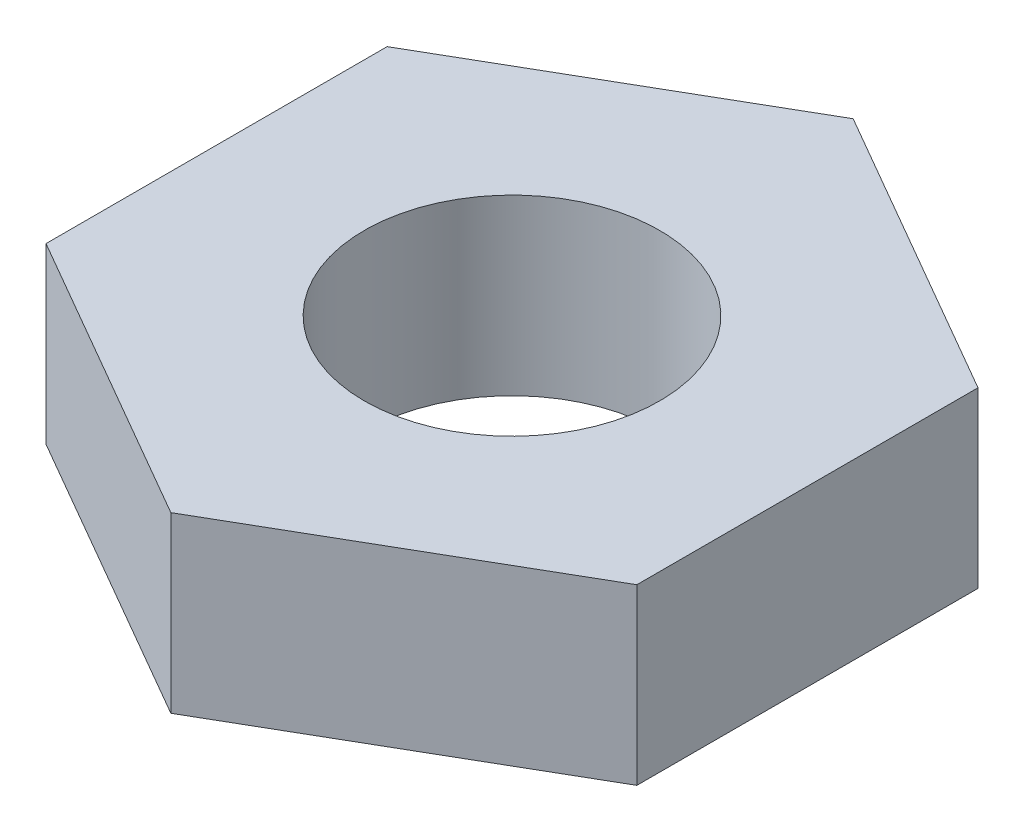
ISO-10303-21;
HEADER;
FILE_DESCRIPTION(('STEP AP214'),'2;1');
FILE_NAME('part.step','',(''),(''),'','','');
FILE_SCHEMA(('AUTOMOTIVE_DESIGN { 1 0 10303 214 1 1 1 1 }'));
ENDSEC;
DATA;
#1=APPLICATION_CONTEXT('core data for automotive mechanical design processes');
#2=APPLICATION_PROTOCOL_DEFINITION('international standard','automotive_design',2000,#1);
#3=PRODUCT_CONTEXT('',#1,'mechanical');
#4=PRODUCT('Part','Part','',(#3));
#5=PRODUCT_RELATED_PRODUCT_CATEGORY('part','',(#4));
#6=PRODUCT_DEFINITION_FORMATION('','',#4);
#7=PRODUCT_DEFINITION_CONTEXT('part definition',#1,'design');
#8=PRODUCT_DEFINITION('design','',#6,#7);
#9=PRODUCT_DEFINITION_SHAPE('','',#8);
#10=(LENGTH_UNIT() NAMED_UNIT(*) SI_UNIT(.MILLI.,.METRE.));
#11=(NAMED_UNIT(*) PLANE_ANGLE_UNIT() SI_UNIT($,.RADIAN.));
#12=(NAMED_UNIT(*) SI_UNIT($,.STERADIAN.) SOLID_ANGLE_UNIT());
#13=UNCERTAINTY_MEASURE_WITH_UNIT(LENGTH_MEASURE(1.E-05),#10,'distance_accuracy_value','');
#14=(GEOMETRIC_REPRESENTATION_CONTEXT(3) GLOBAL_UNCERTAINTY_ASSIGNED_CONTEXT((#13)) GLOBAL_UNIT_ASSIGNED_CONTEXT((#10,
#11,#12)) REPRESENTATION_CONTEXT('',''));
#15=CARTESIAN_POINT('',(0.,0.,0.));
#16=DIRECTION('',(0.,0.,1.));
#17=DIRECTION('',(1.,0.,0.));
#18=AXIS2_PLACEMENT_3D('',#15,#16,#17);
#19=CARTESIAN_POINT('',(8.5,5.,-14.7224318643354));
#20=DIRECTION('',(0.,1.,0.));
#21=DIRECTION('',(0.,0.,1.));
#22=AXIS2_PLACEMENT_3D('',#19,#20,#21);
#23=PLANE('',#22);
#24=DIRECTION('',(-0.86602540378444,0.,0.499999999999998));
#25=VECTOR('',#24,1.);
#26=CARTESIAN_POINT('',(-8.5,5.,-4.90747728811181));
#27=LINE('',#26,#25);
#28=CARTESIAN_POINT('',(0.,5.,-9.8149545762236));
#29=VERTEX_POINT('',#28);
#30=CARTESIAN_POINT('',(-8.5,5.,-4.90747728811181));
#31=VERTEX_POINT('',#30);
#32=EDGE_CURVE('E132',#29,#31,#27,.T.);
#33=ORIENTED_EDGE('',*,*,#32,.T.);
#34=DIRECTION('',(0.,0.,1.));
#35=VECTOR('',#34,1.);
#36=CARTESIAN_POINT('',(-8.5,5.,4.90747728811181));
#37=LINE('',#36,#35);
#38=CARTESIAN_POINT('',(-8.5,5.,4.90747728811181));
#39=VERTEX_POINT('',#38);
#40=EDGE_CURVE('E90',#31,#39,#37,.T.);
#41=ORIENTED_EDGE('',*,*,#40,.T.);
#42=DIRECTION('',(0.86602540378444,0.,0.499999999999998));
#43=VECTOR('',#42,1.);
#44=CARTESIAN_POINT('',(-8.5,5.,4.90747728811181));
#45=LINE('',#44,#43);
#46=CARTESIAN_POINT('',(0.,5.,9.8149545762236));
#47=VERTEX_POINT('',#46);
#48=EDGE_CURVE('E103',#39,#47,#45,.T.);
#49=ORIENTED_EDGE('',*,*,#48,.T.);
#50=DIRECTION('',(0.86602540378444,0.,-0.499999999999998));
#51=VECTOR('',#50,1.);
#52=CARTESIAN_POINT('',(8.5,5.,4.90747728811181));
#53=LINE('',#52,#51);
#54=CARTESIAN_POINT('',(8.5,5.,4.90747728811181));
#55=VERTEX_POINT('',#54);
#56=EDGE_CURVE('E97',#47,#55,#53,.T.);
#57=ORIENTED_EDGE('',*,*,#56,.T.);
#58=DIRECTION('',(0.,0.,-1.));
#59=VECTOR('',#58,1.);
#60=CARTESIAN_POINT('',(8.5,5.,4.90747728811181));
#61=LINE('',#60,#59);
#62=CARTESIAN_POINT('',(8.5,5.,-4.90747728811181));
#63=VERTEX_POINT('',#62);
#64=EDGE_CURVE('E101',#55,#63,#61,.T.);
#65=ORIENTED_EDGE('',*,*,#64,.T.);
#66=DIRECTION('',(-0.86602540378444,0.,-0.499999999999998));
#67=VECTOR('',#66,1.);
#68=CARTESIAN_POINT('',(8.5,5.,-4.90747728811181));
#69=LINE('',#68,#67);
#70=EDGE_CURVE('E53',#63,#29,#69,.T.);
#71=ORIENTED_EDGE('',*,*,#70,.T.);
#72=EDGE_LOOP('',(#33,#41,#49,#57,#65,#71));
#73=FACE_BOUND('',#72,.T.);
#74=CARTESIAN_POINT('',(0.,5.,0.));
#75=DIRECTION('',(0.,1.,0.));
#76=DIRECTION('',(0.,0.,1.));
#77=AXIS2_PLACEMENT_3D('',#74,#75,#76);
#78=CIRCLE('',#77,4.25);
#79=CARTESIAN_POINT('',(0.,5.,4.25));
#80=VERTEX_POINT('',#79);
#81=EDGE_CURVE('E125',#80,#80,#78,.T.);
#82=ORIENTED_EDGE('',*,*,#81,.F.);
#83=EDGE_LOOP('',(#82));
#84=FACE_BOUND('',#83,.T.);
#85=ADVANCED_FACE('F36',(#73,#84),#23,.T.);
#86=CARTESIAN_POINT('',(8.5,0.,-14.7224318643354));
#87=DIRECTION('',(0.,1.,0.));
#88=DIRECTION('',(0.,0.,1.));
#89=AXIS2_PLACEMENT_3D('',#86,#87,#88);
#90=PLANE('',#89);
#91=DIRECTION('',(-0.86602540378444,0.,0.499999999999998));
#92=VECTOR('',#91,1.);
#93=CARTESIAN_POINT('',(-8.5,0.,-4.90747728811181));
#94=LINE('',#93,#92);
#95=CARTESIAN_POINT('',(0.,0.,-9.8149545762236));
#96=VERTEX_POINT('',#95);
#97=CARTESIAN_POINT('',(-8.5,0.,-4.90747728811181));
#98=VERTEX_POINT('',#97);
#99=EDGE_CURVE('E121',#96,#98,#94,.T.);
#100=ORIENTED_EDGE('',*,*,#99,.F.);
#101=DIRECTION('',(-0.86602540378444,0.,-0.499999999999998));
#102=VECTOR('',#101,1.);
#103=CARTESIAN_POINT('',(8.5,0.,-4.90747728811181));
#104=LINE('',#103,#102);
#105=CARTESIAN_POINT('',(8.5,0.,-4.90747728811181));
#106=VERTEX_POINT('',#105);
#107=EDGE_CURVE('E82',#106,#96,#104,.T.);
#108=ORIENTED_EDGE('',*,*,#107,.F.);
#109=DIRECTION('',(0.,0.,-1.));
#110=VECTOR('',#109,1.);
#111=CARTESIAN_POINT('',(8.5,0.,4.90747728811181));
#112=LINE('',#111,#110);
#113=CARTESIAN_POINT('',(8.5,0.,4.90747728811181));
#114=VERTEX_POINT('',#113);
#115=EDGE_CURVE('E76',#114,#106,#112,.T.);
#116=ORIENTED_EDGE('',*,*,#115,.F.);
#117=DIRECTION('',(0.86602540378444,0.,-0.499999999999998));
#118=VECTOR('',#117,1.);
#119=CARTESIAN_POINT('',(8.5,0.,4.90747728811181));
#120=LINE('',#119,#118);
#121=CARTESIAN_POINT('',(0.,0.,9.8149545762236));
#122=VERTEX_POINT('',#121);
#123=EDGE_CURVE('E111',#122,#114,#120,.T.);
#124=ORIENTED_EDGE('',*,*,#123,.F.);
#125=DIRECTION('',(0.86602540378444,0.,0.499999999999998));
#126=VECTOR('',#125,1.);
#127=CARTESIAN_POINT('',(-8.5,0.,4.90747728811181));
#128=LINE('',#127,#126);
#129=CARTESIAN_POINT('',(-8.5,0.,4.90747728811181));
#130=VERTEX_POINT('',#129);
#131=EDGE_CURVE('E127',#130,#122,#128,.T.);
#132=ORIENTED_EDGE('',*,*,#131,.F.);
#133=DIRECTION('',(0.,0.,1.));
#134=VECTOR('',#133,1.);
#135=CARTESIAN_POINT('',(-8.5,0.,4.90747728811181));
#136=LINE('',#135,#134);
#137=EDGE_CURVE('E124',#98,#130,#136,.T.);
#138=ORIENTED_EDGE('',*,*,#137,.F.);
#139=EDGE_LOOP('',(#100,#108,#116,#124,#132,#138));
#140=FACE_BOUND('',#139,.T.);
#141=CARTESIAN_POINT('',(0.,0.,0.));
#142=DIRECTION('',(0.,1.,0.));
#143=DIRECTION('',(0.,0.,1.));
#144=AXIS2_PLACEMENT_3D('',#141,#142,#143);
#145=CIRCLE('',#144,4.25);
#146=CARTESIAN_POINT('',(0.,0.,4.25));
#147=VERTEX_POINT('',#146);
#148=EDGE_CURVE('E227',#147,#147,#145,.T.);
#149=ORIENTED_EDGE('',*,*,#148,.T.);
#150=EDGE_LOOP('',(#149));
#151=FACE_BOUND('',#150,.T.);
#152=ADVANCED_FACE('F141',(#140,#151),#90,.F.);
#153=CARTESIAN_POINT('',(-8.5,5.,-4.90747728811181));
#154=DIRECTION('',(0.499999999999998,0.,0.86602540378444));
#155=DIRECTION('',(0.86602540378444,0.,-0.499999999999998));
#156=AXIS2_PLACEMENT_3D('',#153,#154,#155);
#157=PLANE('',#156);
#158=ORIENTED_EDGE('',*,*,#99,.T.);
#159=DIRECTION('',(0.,-1.,0.));
#160=VECTOR('',#159,1.);
#161=CARTESIAN_POINT('',(-8.5,5.,-4.90747728811181));
#162=LINE('',#161,#160);
#163=EDGE_CURVE('E11',#31,#98,#162,.T.);
#164=ORIENTED_EDGE('',*,*,#163,.F.);
#165=ORIENTED_EDGE('',*,*,#32,.F.);
#166=DIRECTION('',(0.,-1.,0.));
#167=VECTOR('',#166,1.);
#168=CARTESIAN_POINT('',(0.,5.,-9.8149545762236));
#169=LINE('',#168,#167);
#170=EDGE_CURVE('E117',#29,#96,#169,.T.);
#171=ORIENTED_EDGE('',*,*,#170,.T.);
#172=EDGE_LOOP('',(#158,#164,#165,#171));
#173=FACE_BOUND('',#172,.T.);
#174=ADVANCED_FACE('F38',(#173),#157,.F.);
#175=CARTESIAN_POINT('',(-8.5,5.,4.90747728811181));
#176=DIRECTION('',(1.,0.,0.));
#177=DIRECTION('',(0.,0.,-1.));
#178=AXIS2_PLACEMENT_3D('',#175,#176,#177);
#179=PLANE('',#178);
#180=ORIENTED_EDGE('',*,*,#137,.T.);
#181=DIRECTION('',(0.,-1.,0.));
#182=VECTOR('',#181,1.);
#183=CARTESIAN_POINT('',(-8.5,5.,4.90747728811181));
#184=LINE('',#183,#182);
#185=EDGE_CURVE('E45',#39,#130,#184,.T.);
#186=ORIENTED_EDGE('',*,*,#185,.F.);
#187=ORIENTED_EDGE('',*,*,#40,.F.);
#188=ORIENTED_EDGE('',*,*,#163,.T.);
#189=EDGE_LOOP('',(#180,#186,#187,#188));
#190=FACE_BOUND('',#189,.T.);
#191=ADVANCED_FACE('F166',(#190),#179,.F.);
#192=CARTESIAN_POINT('',(-8.5,5.,4.90747728811181));
#193=DIRECTION('',(0.499999999999998,0.,-0.86602540378444));
#194=DIRECTION('',(-0.86602540378444,0.,-0.499999999999998));
#195=AXIS2_PLACEMENT_3D('',#192,#193,#194);
#196=PLANE('',#195);
#197=ORIENTED_EDGE('',*,*,#131,.T.);
#198=DIRECTION('',(0.,-1.,0.));
#199=VECTOR('',#198,1.);
#200=CARTESIAN_POINT('',(0.,5.,9.8149545762236));
#201=LINE('',#200,#199);
#202=EDGE_CURVE('E112',#47,#122,#201,.T.);
#203=ORIENTED_EDGE('',*,*,#202,.F.);
#204=ORIENTED_EDGE('',*,*,#48,.F.);
#205=ORIENTED_EDGE('',*,*,#185,.T.);
#206=EDGE_LOOP('',(#197,#203,#204,#205));
#207=FACE_BOUND('',#206,.T.);
#208=ADVANCED_FACE('F138',(#207),#196,.F.);
#209=CARTESIAN_POINT('',(8.5,5.,4.90747728811181));
#210=DIRECTION('',(-0.499999999999998,0.,-0.86602540378444));
#211=DIRECTION('',(-0.86602540378444,0.,0.499999999999998));
#212=AXIS2_PLACEMENT_3D('',#209,#210,#211);
#213=PLANE('',#212);
#214=ORIENTED_EDGE('',*,*,#123,.T.);
#215=DIRECTION('',(0.,-1.,0.));
#216=VECTOR('',#215,1.);
#217=CARTESIAN_POINT('',(8.5,5.,4.90747728811181));
#218=LINE('',#217,#216);
#219=EDGE_CURVE('E108',#55,#114,#218,.T.);
#220=ORIENTED_EDGE('',*,*,#219,.F.);
#221=ORIENTED_EDGE('',*,*,#56,.F.);
#222=ORIENTED_EDGE('',*,*,#202,.T.);
#223=EDGE_LOOP('',(#214,#220,#221,#222));
#224=FACE_BOUND('',#223,.T.);
#225=ADVANCED_FACE('F109',(#224),#213,.F.);
#226=CARTESIAN_POINT('',(8.5,5.,4.90747728811181));
#227=DIRECTION('',(-1.,0.,0.));
#228=DIRECTION('',(0.,0.,1.));
#229=AXIS2_PLACEMENT_3D('',#226,#227,#228);
#230=PLANE('',#229);
#231=ORIENTED_EDGE('',*,*,#115,.T.);
#232=DIRECTION('',(0.,-1.,0.));
#233=VECTOR('',#232,1.);
#234=CARTESIAN_POINT('',(8.5,5.,-4.90747728811181));
#235=LINE('',#234,#233);
#236=EDGE_CURVE('E113',#63,#106,#235,.T.);
#237=ORIENTED_EDGE('',*,*,#236,.F.);
#238=ORIENTED_EDGE('',*,*,#64,.F.);
#239=ORIENTED_EDGE('',*,*,#219,.T.);
#240=EDGE_LOOP('',(#231,#237,#238,#239));
#241=FACE_BOUND('',#240,.T.);
#242=ADVANCED_FACE('F115',(#241),#230,.F.);
#243=CARTESIAN_POINT('',(8.5,5.,-4.90747728811181));
#244=DIRECTION('',(-0.499999999999998,0.,0.86602540378444));
#245=DIRECTION('',(0.86602540378444,0.,0.499999999999998));
#246=AXIS2_PLACEMENT_3D('',#243,#244,#245);
#247=PLANE('',#246);
#248=ORIENTED_EDGE('',*,*,#107,.T.);
#249=ORIENTED_EDGE('',*,*,#170,.F.);
#250=ORIENTED_EDGE('',*,*,#70,.F.);
#251=ORIENTED_EDGE('',*,*,#236,.T.);
#252=EDGE_LOOP('',(#248,#249,#250,#251));
#253=FACE_BOUND('',#252,.T.);
#254=ADVANCED_FACE('F146',(#253),#247,.F.);
#255=CARTESIAN_POINT('',(0.,5.,0.));
#256=DIRECTION('',(0.,-1.,0.));
#257=DIRECTION('',(0.,0.,-1.));
#258=AXIS2_PLACEMENT_3D('',#255,#256,#257);
#259=CYLINDRICAL_SURFACE('',#258,4.25);
#260=ORIENTED_EDGE('',*,*,#81,.T.);
#261=EDGE_LOOP('',(#260));
#262=FACE_BOUND('',#261,.T.);
#263=ORIENTED_EDGE('',*,*,#148,.F.);
#264=EDGE_LOOP('',(#263));
#265=FACE_BOUND('',#264,.T.);
#266=ADVANCED_FACE('F148',(#262,#265),#259,.F.);
#267=CLOSED_SHELL('',(#85,#152,#174,#191,#208,#225,#242,#254,#266));
#268=MANIFOLD_SOLID_BREP('B2',#267);
#269=ADVANCED_BREP_SHAPE_REPRESENTATION('',(#18,#268),#14);
#270=SHAPE_DEFINITION_REPRESENTATION(#9,#269);
ENDSEC;
END-ISO-10303-21;
